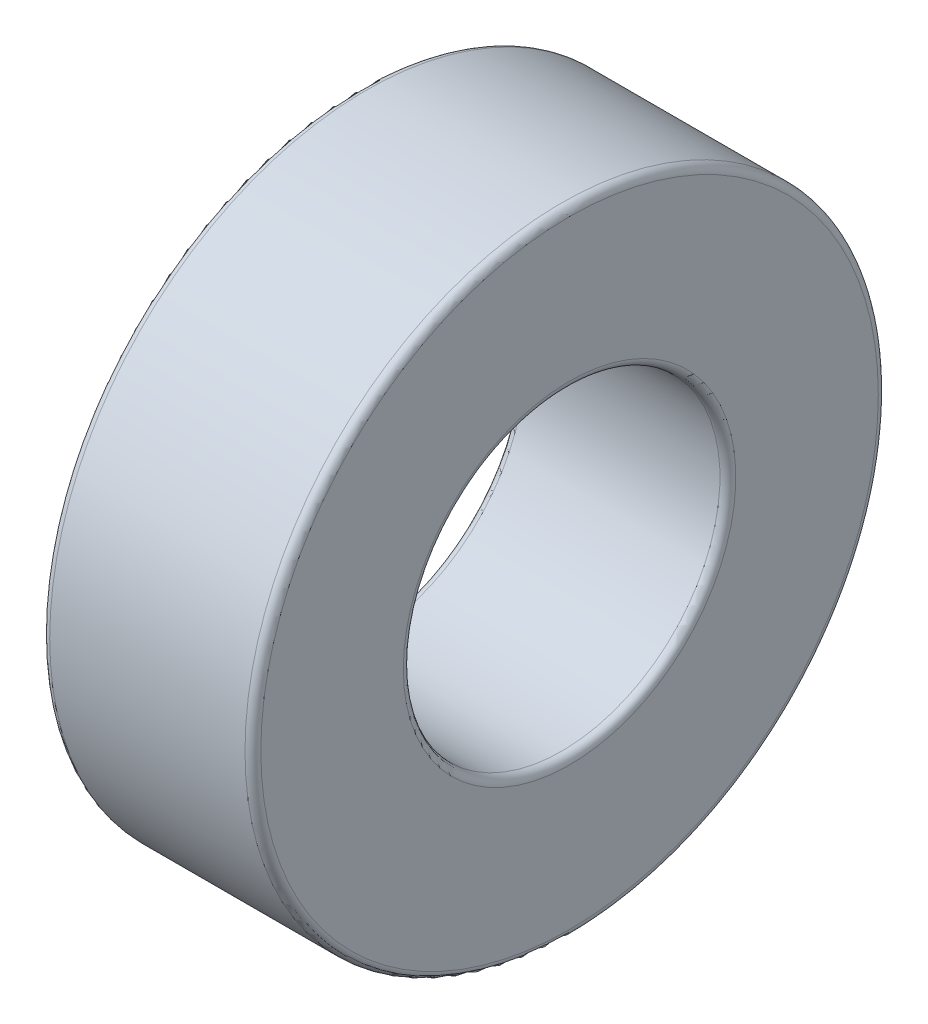
ISO-10303-21;
HEADER;
FILE_DESCRIPTION(('STEP AP214'),'2;1');
FILE_NAME('part.step','',(''),(''),'','','');
FILE_SCHEMA(('AUTOMOTIVE_DESIGN { 1 0 10303 214 1 1 1 1 }'));
ENDSEC;
DATA;
#1=APPLICATION_CONTEXT('core data for automotive mechanical design processes');
#2=APPLICATION_PROTOCOL_DEFINITION('international standard','automotive_design',2000,#1);
#3=PRODUCT_CONTEXT('',#1,'mechanical');
#4=PRODUCT('Part','Part','',(#3));
#5=PRODUCT_RELATED_PRODUCT_CATEGORY('part','',(#4));
#6=PRODUCT_DEFINITION_FORMATION('','',#4);
#7=PRODUCT_DEFINITION_CONTEXT('part definition',#1,'design');
#8=PRODUCT_DEFINITION('design','',#6,#7);
#9=PRODUCT_DEFINITION_SHAPE('','',#8);
#10=(LENGTH_UNIT() NAMED_UNIT(*) SI_UNIT(.MILLI.,.METRE.));
#11=(NAMED_UNIT(*) PLANE_ANGLE_UNIT() SI_UNIT($,.RADIAN.));
#12=(NAMED_UNIT(*) SI_UNIT($,.STERADIAN.) SOLID_ANGLE_UNIT());
#13=UNCERTAINTY_MEASURE_WITH_UNIT(LENGTH_MEASURE(1.E-05),#10,'distance_accuracy_value','');
#14=(GEOMETRIC_REPRESENTATION_CONTEXT(3) GLOBAL_UNCERTAINTY_ASSIGNED_CONTEXT((#13)) GLOBAL_UNIT_ASSIGNED_CONTEXT((#10,
#11,#12)) REPRESENTATION_CONTEXT('',''));
#15=CARTESIAN_POINT('',(0.,0.,0.));
#16=DIRECTION('',(0.,0.,1.));
#17=DIRECTION('',(1.,0.,0.));
#18=AXIS2_PLACEMENT_3D('',#15,#16,#17);
#19=CARTESIAN_POINT('',(0.15,0.,0.));
#20=DIRECTION('',(-1.,0.,0.));
#21=DIRECTION('',(0.,0.,1.));
#22=AXIS2_PLACEMENT_3D('',#19,#20,#21);
#23=CYLINDRICAL_SURFACE('',#22,3.);
#24=CARTESIAN_POINT('',(3.85,0.,0.));
#25=DIRECTION('',(-1.,0.,0.));
#26=DIRECTION('',(0.,0.,1.));
#27=AXIS2_PLACEMENT_3D('',#24,#25,#26);
#28=CIRCLE('',#27,3.);
#29=CARTESIAN_POINT('',(3.85,0.,3.));
#30=VERTEX_POINT('',#29);
#31=EDGE_CURVE('E8',#30,#30,#28,.T.);
#32=ORIENTED_EDGE('',*,*,#31,.F.);
#33=EDGE_LOOP('',(#32));
#34=FACE_BOUND('',#33,.T.);
#35=CARTESIAN_POINT('',(0.15,0.,0.));
#36=DIRECTION('',(-1.,0.,0.));
#37=DIRECTION('',(0.,0.,1.));
#38=AXIS2_PLACEMENT_3D('',#35,#36,#37);
#39=CIRCLE('',#38,3.);
#40=CARTESIAN_POINT('',(0.15,0.,3.));
#41=VERTEX_POINT('',#40);
#42=EDGE_CURVE('E83',#41,#41,#39,.T.);
#43=ORIENTED_EDGE('',*,*,#42,.T.);
#44=EDGE_LOOP('',(#43));
#45=FACE_BOUND('',#44,.T.);
#46=ADVANCED_FACE('F14',(#34,#45),#23,.F.);
#47=CARTESIAN_POINT('',(3.85,0.,0.));
#48=DIRECTION('',(-1.,0.,0.));
#49=DIRECTION('',(0.,0.,1.));
#50=AXIS2_PLACEMENT_3D('',#47,#48,#49);
#51=TOROIDAL_SURFACE('',#50,3.15,0.15);
#52=CARTESIAN_POINT('',(4.,0.,0.));
#53=DIRECTION('',(-1.,0.,0.));
#54=DIRECTION('',(0.,0.,1.));
#55=AXIS2_PLACEMENT_3D('',#52,#53,#54);
#56=CIRCLE('',#55,3.15);
#57=CARTESIAN_POINT('',(4.,0.,3.15));
#58=VERTEX_POINT('',#57);
#59=EDGE_CURVE('E23',#58,#58,#56,.T.);
#60=ORIENTED_EDGE('',*,*,#59,.F.);
#61=EDGE_LOOP('',(#60));
#62=FACE_BOUND('',#61,.T.);
#63=ORIENTED_EDGE('',*,*,#31,.T.);
#64=EDGE_LOOP('',(#63));
#65=FACE_BOUND('',#64,.T.);
#66=ADVANCED_FACE('F113',(#62,#65),#51,.T.);
#67=CARTESIAN_POINT('',(4.,3.15,0.));
#68=DIRECTION('',(-1.,0.,0.));
#69=DIRECTION('',(0.,0.,1.));
#70=AXIS2_PLACEMENT_3D('',#67,#68,#69);
#71=PLANE('',#70);
#72=CARTESIAN_POINT('',(4.,0.,0.));
#73=DIRECTION('',(-1.,0.,0.));
#74=DIRECTION('',(0.,0.,1.));
#75=AXIS2_PLACEMENT_3D('',#72,#73,#74);
#76=CIRCLE('',#75,5.85);
#77=CARTESIAN_POINT('',(4.,0.,5.85));
#78=VERTEX_POINT('',#77);
#79=EDGE_CURVE('E33',#78,#78,#76,.T.);
#80=ORIENTED_EDGE('',*,*,#79,.F.);
#81=EDGE_LOOP('',(#80));
#82=FACE_BOUND('',#81,.T.);
#83=ORIENTED_EDGE('',*,*,#59,.T.);
#84=EDGE_LOOP('',(#83));
#85=FACE_BOUND('',#84,.T.);
#86=ADVANCED_FACE('F110',(#82,#85),#71,.F.);
#87=CARTESIAN_POINT('',(3.85,0.,0.));
#88=DIRECTION('',(-1.,0.,0.));
#89=DIRECTION('',(0.,0.,1.));
#90=AXIS2_PLACEMENT_3D('',#87,#88,#89);
#91=TOROIDAL_SURFACE('',#90,5.85,0.15);
#92=CARTESIAN_POINT('',(3.85,0.,0.));
#93=DIRECTION('',(-1.,0.,0.));
#94=DIRECTION('',(0.,0.,1.));
#95=AXIS2_PLACEMENT_3D('',#92,#93,#94);
#96=CIRCLE('',#95,6.);
#97=CARTESIAN_POINT('',(3.85,0.,6.));
#98=VERTEX_POINT('',#97);
#99=EDGE_CURVE('E98',#98,#98,#96,.T.);
#100=ORIENTED_EDGE('',*,*,#99,.F.);
#101=EDGE_LOOP('',(#100));
#102=FACE_BOUND('',#101,.T.);
#103=ORIENTED_EDGE('',*,*,#79,.T.);
#104=EDGE_LOOP('',(#103));
#105=FACE_BOUND('',#104,.T.);
#106=ADVANCED_FACE('F108',(#102,#105),#91,.T.);
#107=CARTESIAN_POINT('',(0.15,0.,0.));
#108=DIRECTION('',(-1.,0.,0.));
#109=DIRECTION('',(0.,0.,1.));
#110=AXIS2_PLACEMENT_3D('',#107,#108,#109);
#111=CYLINDRICAL_SURFACE('',#110,6.);
#112=CARTESIAN_POINT('',(0.15,0.,0.));
#113=DIRECTION('',(-1.,0.,0.));
#114=DIRECTION('',(0.,0.,1.));
#115=AXIS2_PLACEMENT_3D('',#112,#113,#114);
#116=CIRCLE('',#115,6.);
#117=CARTESIAN_POINT('',(0.15,0.,6.));
#118=VERTEX_POINT('',#117);
#119=EDGE_CURVE('E94',#118,#118,#116,.T.);
#120=ORIENTED_EDGE('',*,*,#119,.F.);
#121=EDGE_LOOP('',(#120));
#122=FACE_BOUND('',#121,.T.);
#123=ORIENTED_EDGE('',*,*,#99,.T.);
#124=EDGE_LOOP('',(#123));
#125=FACE_BOUND('',#124,.T.);
#126=ADVANCED_FACE('F126',(#122,#125),#111,.T.);
#127=CARTESIAN_POINT('',(0.15,0.,0.));
#128=DIRECTION('',(-1.,0.,0.));
#129=DIRECTION('',(0.,0.,1.));
#130=AXIS2_PLACEMENT_3D('',#127,#128,#129);
#131=TOROIDAL_SURFACE('',#130,5.85,0.15);
#132=CARTESIAN_POINT('',(0.,0.,0.));
#133=DIRECTION('',(-1.,0.,0.));
#134=DIRECTION('',(0.,0.,1.));
#135=AXIS2_PLACEMENT_3D('',#132,#133,#134);
#136=CIRCLE('',#135,5.85);
#137=CARTESIAN_POINT('',(0.,0.,5.85));
#138=VERTEX_POINT('',#137);
#139=EDGE_CURVE('E90',#138,#138,#136,.T.);
#140=ORIENTED_EDGE('',*,*,#139,.F.);
#141=EDGE_LOOP('',(#140));
#142=FACE_BOUND('',#141,.T.);
#143=ORIENTED_EDGE('',*,*,#119,.T.);
#144=EDGE_LOOP('',(#143));
#145=FACE_BOUND('',#144,.T.);
#146=ADVANCED_FACE('F130',(#142,#145),#131,.T.);
#147=CARTESIAN_POINT('',(0.,3.15,0.));
#148=DIRECTION('',(-1.,0.,0.));
#149=DIRECTION('',(0.,0.,1.));
#150=AXIS2_PLACEMENT_3D('',#147,#148,#149);
#151=PLANE('',#150);
#152=ORIENTED_EDGE('',*,*,#139,.T.);
#153=EDGE_LOOP('',(#152));
#154=FACE_BOUND('',#153,.T.);
#155=CARTESIAN_POINT('',(0.,0.,0.));
#156=DIRECTION('',(-1.,0.,0.));
#157=DIRECTION('',(0.,0.,1.));
#158=AXIS2_PLACEMENT_3D('',#155,#156,#157);
#159=CIRCLE('',#158,3.15);
#160=CARTESIAN_POINT('',(0.,0.,3.15));
#161=VERTEX_POINT('',#160);
#162=EDGE_CURVE('E86',#161,#161,#159,.T.);
#163=ORIENTED_EDGE('',*,*,#162,.F.);
#164=EDGE_LOOP('',(#163));
#165=FACE_BOUND('',#164,.T.);
#166=ADVANCED_FACE('F134',(#154,#165),#151,.T.);
#167=CARTESIAN_POINT('',(0.15,0.,0.));
#168=DIRECTION('',(-1.,0.,0.));
#169=DIRECTION('',(0.,0.,1.));
#170=AXIS2_PLACEMENT_3D('',#167,#168,#169);
#171=TOROIDAL_SURFACE('',#170,3.15,0.15);
#172=ORIENTED_EDGE('',*,*,#42,.F.);
#173=EDGE_LOOP('',(#172));
#174=FACE_BOUND('',#173,.T.);
#175=ORIENTED_EDGE('',*,*,#162,.T.);
#176=EDGE_LOOP('',(#175));
#177=FACE_BOUND('',#176,.T.);
#178=ADVANCED_FACE('F138',(#174,#177),#171,.T.);
#179=CLOSED_SHELL('',(#46,#66,#86,#106,#126,#146,#166,#178));
#180=CARTESIAN_POINT('',(0.75,0.,0.));
#181=DIRECTION('',(-1.,0.,0.));
#182=DIRECTION('',(0.,0.,-1.));
#183=AXIS2_PLACEMENT_3D('',#180,#181,#182);
#184=CYLINDRICAL_SURFACE('',#183,4.4325);
#185=CARTESIAN_POINT('',(1.9325,0.,0.));
#186=DIRECTION('',(-1.,0.,0.));
#187=DIRECTION('',(0.,-1.,0.));
#188=AXIS2_PLACEMENT_3D('',#185,#186,#187);
#189=CIRCLE('',#188,4.4325);
#190=CARTESIAN_POINT('',(1.9325,-4.4325,0.));
#191=VERTEX_POINT('',#190);
#192=EDGE_CURVE('E63',#191,#191,#189,.T.);
#193=ORIENTED_EDGE('',*,*,#192,.T.);
#194=EDGE_LOOP('',(#193));
#195=FACE_BOUND('',#194,.T.);
#196=CARTESIAN_POINT('',(0.75,0.,0.));
#197=DIRECTION('',(-1.,0.,0.));
#198=DIRECTION('',(0.,0.,-1.));
#199=AXIS2_PLACEMENT_3D('',#196,#197,#198);
#200=CIRCLE('',#199,4.4325);
#201=CARTESIAN_POINT('',(0.75,0.,-4.4325));
#202=VERTEX_POINT('',#201);
#203=EDGE_CURVE('E79',#202,#202,#200,.T.);
#204=ORIENTED_EDGE('',*,*,#203,.F.);
#205=EDGE_LOOP('',(#204));
#206=FACE_BOUND('',#205,.T.);
#207=ADVANCED_FACE('F149',(#195,#206),#184,.T.);
#208=CARTESIAN_POINT('',(0.75,0.,0.));
#209=DIRECTION('',(-1.,0.,0.));
#210=DIRECTION('',(0.,0.,-1.));
#211=AXIS2_PLACEMENT_3D('',#208,#209,#210);
#212=CYLINDRICAL_SURFACE('',#211,4.5675);
#213=CARTESIAN_POINT('',(1.9325,0.,0.));
#214=DIRECTION('',(-1.,0.,0.));
#215=DIRECTION('',(0.,-1.,0.));
#216=AXIS2_PLACEMENT_3D('',#213,#214,#215);
#217=CIRCLE('',#216,4.5675);
#218=CARTESIAN_POINT('',(1.9325,-4.5675,0.));
#219=VERTEX_POINT('',#218);
#220=EDGE_CURVE('E17',#219,#219,#217,.F.);
#221=ORIENTED_EDGE('',*,*,#220,.T.);
#222=EDGE_LOOP('',(#221));
#223=FACE_BOUND('',#222,.T.);
#224=CARTESIAN_POINT('',(0.75,0.,0.));
#225=DIRECTION('',(-1.,0.,0.));
#226=DIRECTION('',(0.,0.,-1.));
#227=AXIS2_PLACEMENT_3D('',#224,#225,#226);
#228=CIRCLE('',#227,4.5675);
#229=CARTESIAN_POINT('',(0.75,0.,-4.5675));
#230=VERTEX_POINT('',#229);
#231=EDGE_CURVE('E75',#230,#230,#228,.T.);
#232=ORIENTED_EDGE('',*,*,#231,.T.);
#233=EDGE_LOOP('',(#232));
#234=FACE_BOUND('',#233,.T.);
#235=ADVANCED_FACE('F155',(#223,#234),#212,.F.);
#236=CARTESIAN_POINT('',(0.75,-4.4325,0.));
#237=DIRECTION('',(-1.,0.,0.));
#238=DIRECTION('',(0.,0.,-1.));
#239=AXIS2_PLACEMENT_3D('',#236,#237,#238);
#240=PLANE('',#239);
#241=ORIENTED_EDGE('',*,*,#231,.F.);
#242=EDGE_LOOP('',(#241));
#243=FACE_BOUND('',#242,.T.);
#244=ORIENTED_EDGE('',*,*,#203,.T.);
#245=EDGE_LOOP('',(#244));
#246=FACE_BOUND('',#245,.T.);
#247=ADVANCED_FACE('F151',(#243,#246),#240,.F.);
#248=CARTESIAN_POINT('',(1.9325,-4.,0.));
#249=DIRECTION('',(-1.,0.,0.));
#250=DIRECTION('',(0.,0.,-1.));
#251=AXIS2_PLACEMENT_3D('',#248,#249,#250);
#252=PLANE('',#251);
#253=CARTESIAN_POINT('',(1.9325,0.,0.));
#254=DIRECTION('',(-1.,0.,0.));
#255=DIRECTION('',(0.,0.,-1.));
#256=AXIS2_PLACEMENT_3D('',#253,#254,#255);
#257=CIRCLE('',#256,5.);
#258=CARTESIAN_POINT('',(1.9325,0.,-5.));
#259=VERTEX_POINT('',#258);
#260=EDGE_CURVE('E51',#259,#259,#257,.T.);
#261=ORIENTED_EDGE('',*,*,#260,.F.);
#262=EDGE_LOOP('',(#261));
#263=FACE_BOUND('',#262,.T.);
#264=ORIENTED_EDGE('',*,*,#220,.F.);
#265=EDGE_LOOP('',(#264));
#266=FACE_BOUND('',#265,.T.);
#267=ADVANCED_FACE('F154',(#263,#266),#252,.F.);
#268=CARTESIAN_POINT('',(1.9325,0.,0.));
#269=DIRECTION('',(-1.,0.,0.));
#270=DIRECTION('',(0.,0.,-1.));
#271=AXIS2_PLACEMENT_3D('',#268,#269,#270);
#272=CYLINDRICAL_SURFACE('',#271,5.);
#273=CARTESIAN_POINT('',(2.0675,0.,0.));
#274=DIRECTION('',(-1.,0.,0.));
#275=DIRECTION('',(0.,0.,-1.));
#276=AXIS2_PLACEMENT_3D('',#273,#274,#275);
#277=CIRCLE('',#276,5.);
#278=CARTESIAN_POINT('',(2.0675,0.,-5.));
#279=VERTEX_POINT('',#278);
#280=EDGE_CURVE('E59',#279,#279,#277,.T.);
#281=ORIENTED_EDGE('',*,*,#280,.F.);
#282=EDGE_LOOP('',(#281));
#283=FACE_BOUND('',#282,.T.);
#284=ORIENTED_EDGE('',*,*,#260,.T.);
#285=EDGE_LOOP('',(#284));
#286=FACE_BOUND('',#285,.T.);
#287=ADVANCED_FACE('F171',(#283,#286),#272,.F.);
#288=CARTESIAN_POINT('',(2.0675,-5.,0.));
#289=DIRECTION('',(1.,0.,0.));
#290=DIRECTION('',(0.,0.,1.));
#291=AXIS2_PLACEMENT_3D('',#288,#289,#290);
#292=PLANE('',#291);
#293=ORIENTED_EDGE('',*,*,#280,.T.);
#294=EDGE_LOOP('',(#293));
#295=FACE_BOUND('',#294,.T.);
#296=CARTESIAN_POINT('',(2.0675,0.,0.));
#297=DIRECTION('',(1.,0.,0.));
#298=DIRECTION('',(0.,1.,0.));
#299=AXIS2_PLACEMENT_3D('',#296,#297,#298);
#300=CIRCLE('',#299,4.5675);
#301=CARTESIAN_POINT('',(2.0675,4.5675,0.));
#302=VERTEX_POINT('',#301);
#303=EDGE_CURVE('E36',#302,#302,#300,.F.);
#304=ORIENTED_EDGE('',*,*,#303,.F.);
#305=EDGE_LOOP('',(#304));
#306=FACE_BOUND('',#305,.T.);
#307=ADVANCED_FACE('F170',(#295,#306),#292,.F.);
#308=CARTESIAN_POINT('',(1.9325,0.,0.));
#309=DIRECTION('',(-1.,0.,0.));
#310=DIRECTION('',(0.,0.,-1.));
#311=AXIS2_PLACEMENT_3D('',#308,#309,#310);
#312=CIRCLE('',#311,4.);
#313=CARTESIAN_POINT('',(1.9325,0.,-4.));
#314=VERTEX_POINT('',#313);
#315=EDGE_CURVE('E40',#314,#314,#312,.T.);
#316=ORIENTED_EDGE('',*,*,#315,.T.);
#317=EDGE_LOOP('',(#316));
#318=FACE_BOUND('',#317,.T.);
#319=ORIENTED_EDGE('',*,*,#192,.F.);
#320=EDGE_LOOP('',(#319));
#321=FACE_BOUND('',#320,.T.);
#322=ADVANCED_FACE('F167',(#318,#321),#252,.F.);
#323=CARTESIAN_POINT('',(2.0675,0.,0.));
#324=DIRECTION('',(-1.,0.,0.));
#325=DIRECTION('',(0.,0.,-1.));
#326=AXIS2_PLACEMENT_3D('',#323,#324,#325);
#327=CIRCLE('',#326,4.);
#328=CARTESIAN_POINT('',(2.0675,0.,-4.));
#329=VERTEX_POINT('',#328);
#330=EDGE_CURVE('E231',#329,#329,#327,.T.);
#331=ORIENTED_EDGE('',*,*,#330,.F.);
#332=EDGE_LOOP('',(#331));
#333=FACE_BOUND('',#332,.T.);
#334=CARTESIAN_POINT('',(2.0675,0.,0.));
#335=DIRECTION('',(1.,0.,0.));
#336=DIRECTION('',(0.,1.,0.));
#337=AXIS2_PLACEMENT_3D('',#334,#335,#336);
#338=CIRCLE('',#337,4.4325);
#339=CARTESIAN_POINT('',(2.0675,4.4325,0.));
#340=VERTEX_POINT('',#339);
#341=EDGE_CURVE('E39',#340,#340,#338,.T.);
#342=ORIENTED_EDGE('',*,*,#341,.F.);
#343=EDGE_LOOP('',(#342));
#344=FACE_BOUND('',#343,.T.);
#345=ADVANCED_FACE('F165',(#333,#344),#292,.F.);
#346=CARTESIAN_POINT('',(1.9325,0.,0.));
#347=DIRECTION('',(-1.,0.,0.));
#348=DIRECTION('',(0.,0.,-1.));
#349=AXIS2_PLACEMENT_3D('',#346,#347,#348);
#350=CYLINDRICAL_SURFACE('',#349,4.);
#351=ORIENTED_EDGE('',*,*,#315,.F.);
#352=EDGE_LOOP('',(#351));
#353=FACE_BOUND('',#352,.T.);
#354=ORIENTED_EDGE('',*,*,#330,.T.);
#355=EDGE_LOOP('',(#354));
#356=FACE_BOUND('',#355,.T.);
#357=ADVANCED_FACE('F147',(#353,#356),#350,.T.);
#358=ORIENTED_EDGE('',*,*,#341,.T.);
#359=EDGE_LOOP('',(#358));
#360=FACE_BOUND('',#359,.T.);
#361=CARTESIAN_POINT('',(3.25,0.,0.));
#362=DIRECTION('',(-1.,0.,0.));
#363=DIRECTION('',(0.,0.,-1.));
#364=AXIS2_PLACEMENT_3D('',#361,#362,#363);
#365=CIRCLE('',#364,4.4325);
#366=CARTESIAN_POINT('',(3.25,0.,-4.4325));
#367=VERTEX_POINT('',#366);
#368=EDGE_CURVE('E67',#367,#367,#365,.T.);
#369=ORIENTED_EDGE('',*,*,#368,.T.);
#370=EDGE_LOOP('',(#369));
#371=FACE_BOUND('',#370,.T.);
#372=ADVANCED_FACE('F143',(#360,#371),#184,.T.);
#373=CARTESIAN_POINT('',(3.25,-4.5675,0.));
#374=DIRECTION('',(1.,0.,0.));
#375=DIRECTION('',(0.,0.,1.));
#376=AXIS2_PLACEMENT_3D('',#373,#374,#375);
#377=PLANE('',#376);
#378=ORIENTED_EDGE('',*,*,#368,.F.);
#379=EDGE_LOOP('',(#378));
#380=FACE_BOUND('',#379,.T.);
#381=CARTESIAN_POINT('',(3.25,0.,0.));
#382=DIRECTION('',(-1.,0.,0.));
#383=DIRECTION('',(0.,0.,-1.));
#384=AXIS2_PLACEMENT_3D('',#381,#382,#383);
#385=CIRCLE('',#384,4.5675);
#386=CARTESIAN_POINT('',(3.25,0.,-4.5675));
#387=VERTEX_POINT('',#386);
#388=EDGE_CURVE('E71',#387,#387,#385,.T.);
#389=ORIENTED_EDGE('',*,*,#388,.T.);
#390=EDGE_LOOP('',(#389));
#391=FACE_BOUND('',#390,.T.);
#392=ADVANCED_FACE('F146',(#380,#391),#377,.F.);
#393=ORIENTED_EDGE('',*,*,#303,.T.);
#394=EDGE_LOOP('',(#393));
#395=FACE_BOUND('',#394,.T.);
#396=ORIENTED_EDGE('',*,*,#388,.F.);
#397=EDGE_LOOP('',(#396));
#398=FACE_BOUND('',#397,.T.);
#399=ADVANCED_FACE('F157',(#395,#398),#212,.F.);
#400=CLOSED_SHELL('',(#207,#235,#247,#267,#287,#307,#322,#345,#357,#372,#392,#399));
#401=ORIENTED_CLOSED_SHELL('',*,#400,.T.);
#402=BREP_WITH_VOIDS('B1',#179,(#401));
#403=ADVANCED_BREP_SHAPE_REPRESENTATION('',(#18,#402),#14);
#404=SHAPE_DEFINITION_REPRESENTATION(#9,#403);
ENDSEC;
END-ISO-10303-21;
